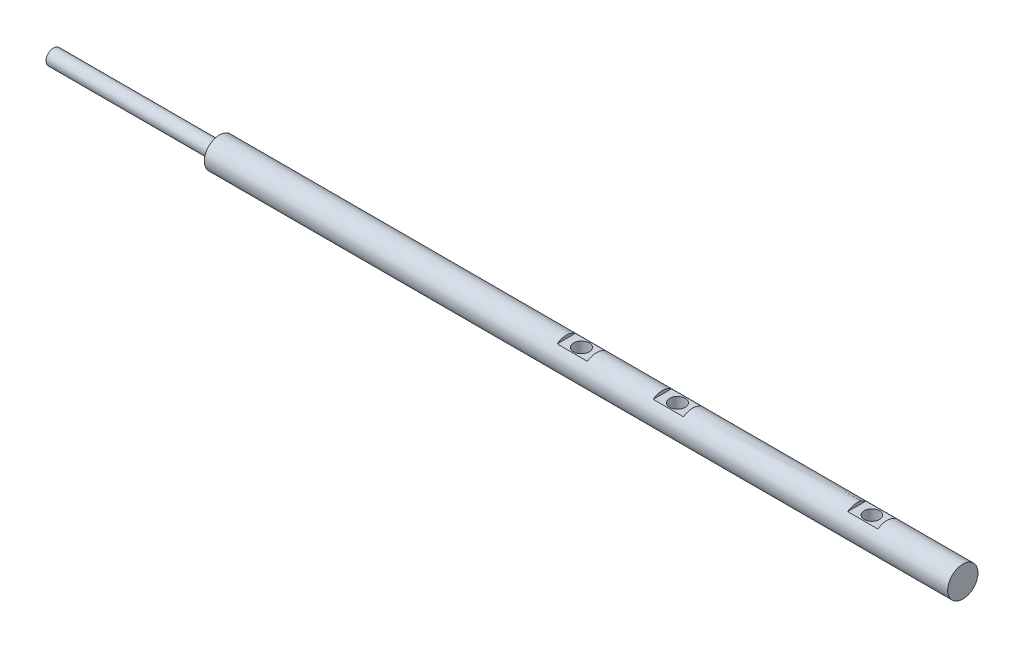
ISO-10303-21;
HEADER;
FILE_DESCRIPTION(('STEP AP214'),'2;1');
FILE_NAME('part.step','',(''),(''),'','','');
FILE_SCHEMA(('AUTOMOTIVE_DESIGN { 1 0 10303 214 1 1 1 1 }'));
ENDSEC;
DATA;
#1=APPLICATION_CONTEXT('core data for automotive mechanical design processes');
#2=APPLICATION_PROTOCOL_DEFINITION('international standard','automotive_design',2000,#1);
#3=PRODUCT_CONTEXT('',#1,'mechanical');
#4=PRODUCT('Part','Part','',(#3));
#5=PRODUCT_RELATED_PRODUCT_CATEGORY('part','',(#4));
#6=PRODUCT_DEFINITION_FORMATION('','',#4);
#7=PRODUCT_DEFINITION_CONTEXT('part definition',#1,'design');
#8=PRODUCT_DEFINITION('design','',#6,#7);
#9=PRODUCT_DEFINITION_SHAPE('','',#8);
#10=(LENGTH_UNIT() NAMED_UNIT(*) SI_UNIT(.MILLI.,.METRE.));
#11=(NAMED_UNIT(*) PLANE_ANGLE_UNIT() SI_UNIT($,.RADIAN.));
#12=(NAMED_UNIT(*) SI_UNIT($,.STERADIAN.) SOLID_ANGLE_UNIT());
#13=UNCERTAINTY_MEASURE_WITH_UNIT(LENGTH_MEASURE(1.E-05),#10,'distance_accuracy_value','');
#14=(GEOMETRIC_REPRESENTATION_CONTEXT(3) GLOBAL_UNCERTAINTY_ASSIGNED_CONTEXT((#13)) GLOBAL_UNIT_ASSIGNED_CONTEXT((#10,
#11,#12)) REPRESENTATION_CONTEXT('',''));
#15=CARTESIAN_POINT('',(0.,0.,0.));
#16=DIRECTION('',(0.,0.,1.));
#17=DIRECTION('',(1.,0.,0.));
#18=AXIS2_PLACEMENT_3D('',#15,#16,#17);
#19=CARTESIAN_POINT('',(95.25,0.,0.));
#20=DIRECTION('',(-1.,0.,0.));
#21=DIRECTION('',(0.,0.,1.));
#22=AXIS2_PLACEMENT_3D('',#19,#20,#21);
#23=CYLINDRICAL_SURFACE('',#22,3.175);
#24=CARTESIAN_POINT('',(-60.49518,0.,0.));
#25=DIRECTION('',(-1.,0.,0.));
#26=DIRECTION('',(0.,0.,1.));
#27=AXIS2_PLACEMENT_3D('',#24,#25,#26);
#28=CIRCLE('',#27,3.175);
#29=CARTESIAN_POINT('',(-60.49518,0.,3.175));
#30=VERTEX_POINT('',#29);
#31=EDGE_CURVE('E116',#30,#30,#28,.T.);
#32=ORIENTED_EDGE('',*,*,#31,.F.);
#33=EDGE_LOOP('',(#32));
#34=FACE_BOUND('',#33,.T.);
#35=CARTESIAN_POINT('',(13.70965,-3.175,0.));
#36=CARTESIAN_POINT('',(13.7096555225033,-3.1749951488375,0.0855040308867805));
#37=CARTESIAN_POINT('',(13.716409178857,-3.17150945034315,0.171101240980395));
#38=CARTESIAN_POINT('',(13.7431163776356,-3.15790866903868,0.339747436628676));
#39=CARTESIAN_POINT('',(13.7630930920065,-3.14778194886196,0.422791680581358));
#40=CARTESIAN_POINT('',(13.8152492367121,-3.12195472243027,0.583638724841478));
#41=CARTESIAN_POINT('',(13.847380383854,-3.10627628578511,0.661460848087699));
#42=CARTESIAN_POINT('',(13.922673342814,-3.07076815311594,0.810484123550459));
#43=CARTESIAN_POINT('',(13.9658346813397,-3.05093863521649,0.881685559674048));
#44=CARTESIAN_POINT('',(14.0650395604511,-3.00746719747756,1.02048121130391));
#45=CARTESIAN_POINT('',(14.1217224488686,-2.98366396287073,1.08756713179621));
#46=CARTESIAN_POINT('',(14.2449778321314,-2.93542614793103,1.2117528273621));
#47=CARTESIAN_POINT('',(14.311558245603,-2.91099107513947,1.2688445260646));
#48=CARTESIAN_POINT('',(14.4593429961395,-2.86190360269902,1.37619030697555));
#49=CARTESIAN_POINT('',(14.5413028961507,-2.8374019830861,1.4254815020746));
#50=CARTESIAN_POINT('',(14.7137279187006,-2.79368352283181,1.50937386299454));
#51=CARTESIAN_POINT('',(14.804186670407,-2.77446276535016,1.54398592681111));
#52=CARTESIAN_POINT('',(14.9854318810971,-2.74531170361422,1.59521646703194));
#53=CARTESIAN_POINT('',(15.0758597461213,-2.7348849779048,1.61280618820741));
#54=CARTESIAN_POINT('',(15.2589330951833,-2.72321398214474,1.63244506669712));
#55=CARTESIAN_POINT('',(15.3515760410271,-2.72195966421048,1.63451122931009));
#56=CARTESIAN_POINT('',(15.5236642889754,-2.72838052371713,1.62375488998901));
#57=CARTESIAN_POINT('',(15.6032793205153,-2.73493188161207,1.61280661192532));
#58=CARTESIAN_POINT('',(15.7593289781891,-2.754244052702,1.57959805780023));
#59=CARTESIAN_POINT('',(15.8357624793788,-2.76700704233323,1.55733381672187));
#60=CARTESIAN_POINT('',(15.9854619863812,-2.79757317703649,1.50174237151051));
#61=CARTESIAN_POINT('',(16.0586140956642,-2.81548590050608,1.46817158068447));
#62=CARTESIAN_POINT('',(16.1986068420419,-2.85434643346265,1.3911117741889));
#63=CARTESIAN_POINT('',(16.2654446252442,-2.87529560459822,1.34761830379583));
#64=CARTESIAN_POINT('',(16.4004112960908,-2.9212823355769,1.24510866496992));
#65=CARTESIAN_POINT('',(16.4674961673622,-2.94649001082675,1.18478955639875));
#66=CARTESIAN_POINT('',(16.5910475723355,-2.99587607308416,1.05368879547657));
#67=CARTESIAN_POINT('',(16.6475084679871,-3.02005390832908,0.982901623202313));
#68=CARTESIAN_POINT('',(16.7509700161712,-3.06617549731913,0.828265705690739));
#69=CARTESIAN_POINT('',(16.7973314172438,-3.08793935855511,0.743931167771745));
#70=CARTESIAN_POINT('',(16.8748180876571,-3.12521410360782,0.567260694455102));
#71=CARTESIAN_POINT('',(16.9059560898711,-3.14073021113217,0.474931522136976));
#72=CARTESIAN_POINT('',(16.9494353646927,-3.16262223827194,0.293387639639186));
#73=CARTESIAN_POINT('',(16.9631610922109,-3.16966860606962,0.204586275933954));
#74=CARTESIAN_POINT('',(16.9758065067292,-3.17615517440242,0.0256756682936787));
#75=CARTESIAN_POINT('',(16.9747338203541,-3.1755992928927,-0.0644328780430827));
#76=CARTESIAN_POINT('',(16.9585694600984,-3.16732011452037,-0.23544240019834));
#77=CARTESIAN_POINT('',(16.9446474939361,-3.16019489932875,-0.316487355429186));
#78=CARTESIAN_POINT('',(16.9050532383627,-3.14029584966157,-0.474914137414348));
#79=CARTESIAN_POINT('',(16.8793796852722,-3.12752140771467,-0.552295569232577));
#80=CARTESIAN_POINT('',(16.8163979936897,-3.0970332421052,-0.703659850689299));
#81=CARTESIAN_POINT('',(16.7787917765208,-3.07919436719925,-0.777492553668176));
#82=CARTESIAN_POINT('',(16.6933576756426,-3.04025788262466,-0.918032193793198));
#83=CARTESIAN_POINT('',(16.6455255652911,-3.01915892647785,-0.984736167288267));
#84=CARTESIAN_POINT('',(16.5353647755565,-2.97316030571577,-1.11637209875045));
#85=CARTESIAN_POINT('',(16.4720535975356,-2.94809264371233,-1.18042445249867));
#86=CARTESIAN_POINT('',(16.3356099268942,-2.89851338679948,-1.29741693757462));
#87=CARTESIAN_POINT('',(16.2624697567467,-2.87400224426708,-1.35034829848397));
#88=CARTESIAN_POINT('',(16.1033223874983,-2.82692373103994,-1.44642697458146));
#89=CARTESIAN_POINT('',(16.0168238429623,-2.80454223847877,-1.4888598544623));
#90=CARTESIAN_POINT('',(15.8364087006801,-2.76667242464635,-1.55811686536916));
#91=CARTESIAN_POINT('',(15.7425023439866,-2.75117477674318,-1.58496213065223));
#92=CARTESIAN_POINT('',(15.5596853526163,-2.73084264145901,-1.61972010578002));
#93=CARTESIAN_POINT('',(15.4711787017558,-2.72511675716505,-1.62922186279037));
#94=CARTESIAN_POINT('',(15.293687714574,-2.72246308853735,-1.63365628662517));
#95=CARTESIAN_POINT('',(15.2047036525793,-2.72553069992366,-1.62859657783691));
#96=CARTESIAN_POINT('',(15.0387499074751,-2.73915192416444,-1.60555713446222));
#97=CARTESIAN_POINT('',(14.9615054098004,-2.74887888063314,-1.5890014905719));
#98=CARTESIAN_POINT('',(14.8109982454205,-2.77369521283357,-1.54527280818543));
#99=CARTESIAN_POINT('',(14.7377369351526,-2.78878640228,-1.51809617829069));
#100=CARTESIAN_POINT('',(14.5918581146745,-2.82384943425745,-1.4518910164788));
#101=CARTESIAN_POINT('',(14.5196078760544,-2.84407923565314,-1.41219413521423));
#102=CARTESIAN_POINT('',(14.3823147021694,-2.88675020129082,-1.32278190926592));
#103=CARTESIAN_POINT('',(14.3172756362287,-2.9091925406384,-1.27306122601301));
#104=CARTESIAN_POINT('',(14.1873779098411,-2.95727706115646,-1.15738981002724));
#105=CARTESIAN_POINT('',(14.1236590585516,-2.98295328229731,-1.09016618990104));
#106=CARTESIAN_POINT('',(14.0081126673504,-3.03196509152523,-0.945333004302657));
#107=CARTESIAN_POINT('',(13.9562920125456,-3.05529932000234,-0.867717466275226));
#108=CARTESIAN_POINT('',(13.8656042427264,-3.09746555259877,-0.70262825629564));
#109=CARTESIAN_POINT('',(13.8269237810695,-3.11623168849883,-0.615034384222231));
#110=CARTESIAN_POINT('',(13.7653591182301,-3.14661314164253,-0.433428747203523));
#111=CARTESIAN_POINT('',(13.7424310751803,-3.15824829587962,-0.339435601668967));
#112=CARTESIAN_POINT('',(13.7218932306584,-3.16872129723131,-0.203672524735649));
#113=CARTESIAN_POINT('',(13.7173093436488,-3.17106888783632,-0.163117552345117));
#114=CARTESIAN_POINT('',(13.7111863698368,-3.17420941832953,-0.0817154873383522));
#115=CARTESIAN_POINT('',(13.7096473604074,-3.1750023187116,-0.0408683873253526));
#116=CARTESIAN_POINT('',(13.70965,-3.175,0.));
#117=B_SPLINE_CURVE_WITH_KNOTS('',3,(#35,#36,#37,#38,#39,#40,#41,#42,#43,#44,#45,#46,#47,#48,
#49,#50,#51,#52,#53,#54,#55,#56,#57,#58,#59,#60,#61,#62,#63,#64,#65,#66,#67,#68,#69,#70,#71,#72,
#73,#74,#75,#76,#77,#78,#79,#80,#81,#82,#83,#84,#85,#86,#87,#88,#89,#90,#91,#92,#93,#94,#95,#96,
#97,#98,#99,#100,#101,#102,#103,#104,#105,#106,#107,#108,#109,#110,#111,#112,#113,#114,#115,
#116),.UNSPECIFIED.,.T.,.F.,(4,2,2,2,2,2,2,2,2,2,2,2,2,2,2,2,2,2,2,2,2,2,2,2,2,2,2,2,2,2,2,2,2,
2,2,2,2,2,2,2,4),(0.,0.256346681545551,0.513143775789516,0.768931283875213,1.02470781826619,
1.29656656346874,1.56864399473168,1.86333819539519,2.15781322626888,2.43427334950283,
2.71043057998311,2.95119493604628,3.19204371210591,3.43845399875807,3.68497512818486,
3.96477950659084,4.2447319584856,4.53914409915753,4.8333095700008,5.10221547434754,
5.37098279845148,5.61746624990919,5.86397621261565,6.11720599093004,6.37054063911959,
6.64979553878126,6.92926984912039,7.22440425351111,7.51913756384896,7.78517049872057,
8.0510641640248,8.28881648429831,8.52664926820862,8.7803088971381,9.03410398105978,
9.3211468197276,9.60835534464037,9.89948790747403,10.1898068764044,10.3123298633967,
10.4348559637725),.UNSPECIFIED.);
#118=CARTESIAN_POINT('',(13.70965,-3.175,0.));
#119=VERTEX_POINT('',#118);
#120=EDGE_CURVE('E151',#119,#119,#117,.T.);
#121=ORIENTED_EDGE('',*,*,#120,.T.);
#122=EDGE_LOOP('',(#121));
#123=FACE_BOUND('',#122,.T.);
#124=DIRECTION('',(-1.,0.,0.));
#125=VECTOR('',#124,1.);
#126=CARTESIAN_POINT('',(95.25,2.54,1.905));
#127=LINE('',#126,#125);
#128=CARTESIAN_POINT('',(18.5166,2.54,1.905));
#129=VERTEX_POINT('',#128);
#130=CARTESIAN_POINT('',(12.1666,2.54,1.905));
#131=VERTEX_POINT('',#130);
#132=EDGE_CURVE('E132',#129,#131,#127,.T.);
#133=ORIENTED_EDGE('',*,*,#132,.T.);
#134=CARTESIAN_POINT('',(12.1666,0.,0.));
#135=DIRECTION('',(-1.,0.,0.));
#136=DIRECTION('',(0.,0.,1.));
#137=AXIS2_PLACEMENT_3D('',#134,#135,#136);
#138=CIRCLE('',#137,3.175);
#139=CARTESIAN_POINT('',(12.1666,2.54,-1.905));
#140=VERTEX_POINT('',#139);
#141=EDGE_CURVE('E208',#131,#140,#138,.T.);
#142=ORIENTED_EDGE('',*,*,#141,.T.);
#143=DIRECTION('',(-1.,0.,0.));
#144=VECTOR('',#143,1.);
#145=CARTESIAN_POINT('',(95.25,2.54,-1.905));
#146=LINE('',#145,#144);
#147=CARTESIAN_POINT('',(18.5166,2.54,-1.905));
#148=VERTEX_POINT('',#147);
#149=EDGE_CURVE('E129',#140,#148,#146,.F.);
#150=ORIENTED_EDGE('',*,*,#149,.T.);
#151=CARTESIAN_POINT('',(18.5166,0.,0.));
#152=DIRECTION('',(-1.,0.,0.));
#153=DIRECTION('',(0.,0.,1.));
#154=AXIS2_PLACEMENT_3D('',#151,#152,#153);
#155=CIRCLE('',#154,3.175);
#156=EDGE_CURVE('E206',#129,#148,#155,.T.);
#157=ORIENTED_EDGE('',*,*,#156,.F.);
#158=EDGE_LOOP('',(#133,#142,#150,#157));
#159=FACE_BOUND('',#158,.T.);
#160=CARTESIAN_POINT('',(33.82645,-3.175,0.));
#161=CARTESIAN_POINT('',(33.8264555225033,-3.1749951488375,0.0855040308867798));
#162=CARTESIAN_POINT('',(33.833209178857,-3.17150945034314,0.171101240980394));
#163=CARTESIAN_POINT('',(33.8599163776356,-3.15790866903868,0.339747436628674));
#164=CARTESIAN_POINT('',(33.8798930920065,-3.14778194886196,0.422791680581357));
#165=CARTESIAN_POINT('',(33.9320492367121,-3.12195472243027,0.583638724841476));
#166=CARTESIAN_POINT('',(33.964180383854,-3.10627628578511,0.661460848087696));
#167=CARTESIAN_POINT('',(34.0394733428141,-3.07076815311594,0.810484123550455));
#168=CARTESIAN_POINT('',(34.0826346813397,-3.05093863521649,0.881685559674045));
#169=CARTESIAN_POINT('',(34.1818395604511,-3.00746719747756,1.02048121130391));
#170=CARTESIAN_POINT('',(34.2385224488686,-2.98366396287073,1.08756713179621));
#171=CARTESIAN_POINT('',(34.3617778321314,-2.93542614793103,1.2117528273621));
#172=CARTESIAN_POINT('',(34.428358245603,-2.91099107513947,1.2688445260646));
#173=CARTESIAN_POINT('',(34.5761429961395,-2.86190360269902,1.37619030697555));
#174=CARTESIAN_POINT('',(34.6581028961507,-2.83740198308611,1.42548150207459));
#175=CARTESIAN_POINT('',(34.8305279187006,-2.79368352283181,1.50937386299453));
#176=CARTESIAN_POINT('',(34.920986670407,-2.77446276535017,1.5439859268111));
#177=CARTESIAN_POINT('',(35.1022318810971,-2.74531170361422,1.59521646703193));
#178=CARTESIAN_POINT('',(35.1926597461213,-2.73488497790481,1.6128061882074));
#179=CARTESIAN_POINT('',(35.3757330951833,-2.72321398214475,1.63244506669711));
#180=CARTESIAN_POINT('',(35.4683760410271,-2.72195966421048,1.63451122931009));
#181=CARTESIAN_POINT('',(35.6404642889754,-2.72838052371714,1.62375488998901));
#182=CARTESIAN_POINT('',(35.7200793205153,-2.73493188161208,1.61280661192532));
#183=CARTESIAN_POINT('',(35.8761289781891,-2.754244052702,1.57959805780023));
#184=CARTESIAN_POINT('',(35.9525624793788,-2.76700704233323,1.55733381672187));
#185=CARTESIAN_POINT('',(36.1022619863812,-2.79757317703649,1.50174237151051));
#186=CARTESIAN_POINT('',(36.1754140956642,-2.81548590050608,1.46817158068447));
#187=CARTESIAN_POINT('',(36.3154068420419,-2.85434643346265,1.3911117741889));
#188=CARTESIAN_POINT('',(36.3822446252442,-2.87529560459822,1.34761830379583));
#189=CARTESIAN_POINT('',(36.5172112960908,-2.9212823355769,1.24510866496992));
#190=CARTESIAN_POINT('',(36.5842961673622,-2.94649001082675,1.18478955639875));
#191=CARTESIAN_POINT('',(36.7078475723355,-2.99587607308416,1.05368879547657));
#192=CARTESIAN_POINT('',(36.7643084679871,-3.02005390832908,0.98290162320231));
#193=CARTESIAN_POINT('',(36.8677700161712,-3.06617549731913,0.828265705690738));
#194=CARTESIAN_POINT('',(36.9141314172438,-3.08793935855511,0.743931167771745));
#195=CARTESIAN_POINT('',(36.9916180876571,-3.12521410360782,0.567260694455102));
#196=CARTESIAN_POINT('',(37.0227560898711,-3.14073021113217,0.474931522136976));
#197=CARTESIAN_POINT('',(37.0662353646927,-3.16262223827194,0.293387639639186));
#198=CARTESIAN_POINT('',(37.0799610922109,-3.16966860606962,0.204586275933954));
#199=CARTESIAN_POINT('',(37.0926065067292,-3.17615517440242,0.0256756682936774));
#200=CARTESIAN_POINT('',(37.0915338203541,-3.1755992928927,-0.0644328780430845));
#201=CARTESIAN_POINT('',(37.0753694600984,-3.16732011452037,-0.23544240019834));
#202=CARTESIAN_POINT('',(37.0614474939361,-3.16019489932875,-0.316487355429185));
#203=CARTESIAN_POINT('',(37.0218532383627,-3.14029584966157,-0.474914137414346));
#204=CARTESIAN_POINT('',(36.9961796852722,-3.12752140771467,-0.552295569232576));
#205=CARTESIAN_POINT('',(36.9331979936897,-3.0970332421052,-0.7036598506893));
#206=CARTESIAN_POINT('',(36.8955917765208,-3.07919436719925,-0.777492553668178));
#207=CARTESIAN_POINT('',(36.8101576756426,-3.04025788262466,-0.918032193793199));
#208=CARTESIAN_POINT('',(36.7623255652911,-3.01915892647785,-0.984736167288267));
#209=CARTESIAN_POINT('',(36.6521647755565,-2.97316030571577,-1.11637209875045));
#210=CARTESIAN_POINT('',(36.5888535975356,-2.94809264371233,-1.18042445249867));
#211=CARTESIAN_POINT('',(36.4524099268942,-2.89851338679948,-1.29741693757462));
#212=CARTESIAN_POINT('',(36.3792697567467,-2.87400224426709,-1.35034829848397));
#213=CARTESIAN_POINT('',(36.2201223874983,-2.82692373103994,-1.44642697458146));
#214=CARTESIAN_POINT('',(36.1336238429623,-2.80454223847877,-1.4888598544623));
#215=CARTESIAN_POINT('',(35.9532087006801,-2.76667242464635,-1.55811686536916));
#216=CARTESIAN_POINT('',(35.8593023439866,-2.75117477674318,-1.58496213065223));
#217=CARTESIAN_POINT('',(35.6764853526163,-2.73084264145901,-1.61972010578002));
#218=CARTESIAN_POINT('',(35.5879787017558,-2.72511675716505,-1.62922186279037));
#219=CARTESIAN_POINT('',(35.410487714574,-2.72246308853736,-1.63365628662516));
#220=CARTESIAN_POINT('',(35.3215036525793,-2.72553069992366,-1.62859657783691));
#221=CARTESIAN_POINT('',(35.1555499074751,-2.73915192416445,-1.60555713446221));
#222=CARTESIAN_POINT('',(35.0783054098004,-2.74887888063314,-1.5890014905719));
#223=CARTESIAN_POINT('',(34.9277982454205,-2.77369521283357,-1.54527280818542));
#224=CARTESIAN_POINT('',(34.8545369351526,-2.78878640228,-1.51809617829068));
#225=CARTESIAN_POINT('',(34.7086581146745,-2.82384943425746,-1.4518910164788));
#226=CARTESIAN_POINT('',(34.6364078760544,-2.84407923565314,-1.41219413521422));
#227=CARTESIAN_POINT('',(34.4991147021694,-2.88675020129082,-1.32278190926592));
#228=CARTESIAN_POINT('',(34.4340756362287,-2.9091925406384,-1.27306122601301));
#229=CARTESIAN_POINT('',(34.3041779098411,-2.95727706115646,-1.15738981002724));
#230=CARTESIAN_POINT('',(34.2404590585516,-2.98295328229731,-1.09016618990103));
#231=CARTESIAN_POINT('',(34.1249126673504,-3.03196509152523,-0.945333004302651));
#232=CARTESIAN_POINT('',(34.0730920125456,-3.05529932000234,-0.867717466275219));
#233=CARTESIAN_POINT('',(33.9824042427265,-3.09746555259877,-0.702628256295633));
#234=CARTESIAN_POINT('',(33.9437237810696,-3.11623168849883,-0.615034384222225));
#235=CARTESIAN_POINT('',(33.8821591182301,-3.14661314164253,-0.433428747203517));
#236=CARTESIAN_POINT('',(33.8592310751803,-3.15824829587962,-0.33943560166896));
#237=CARTESIAN_POINT('',(33.8386932306584,-3.16872129723131,-0.203672524735642));
#238=CARTESIAN_POINT('',(33.8341093436488,-3.17106888783632,-0.163117552345112));
#239=CARTESIAN_POINT('',(33.8279863698368,-3.17420941832953,-0.0817154873383494));
#240=CARTESIAN_POINT('',(33.8264473604074,-3.1750023187116,-0.0408683873253513));
#241=CARTESIAN_POINT('',(33.82645,-3.175,0.));
#242=B_SPLINE_CURVE_WITH_KNOTS('',3,(#160,#161,#162,#163,#164,#165,#166,#167,#168,#169,#170,
#171,#172,#173,#174,#175,#176,#177,#178,#179,#180,#181,#182,#183,#184,#185,#186,#187,#188,#189,
#190,#191,#192,#193,#194,#195,#196,#197,#198,#199,#200,#201,#202,#203,#204,#205,#206,#207,#208,
#209,#210,#211,#212,#213,#214,#215,#216,#217,#218,#219,#220,#221,#222,#223,#224,#225,#226,#227,
#228,#229,#230,#231,#232,#233,#234,#235,#236,#237,#238,#239,#240,#241),.UNSPECIFIED.,.T.,.F.,(4,
2,2,2,2,2,2,2,2,2,2,2,2,2,2,2,2,2,2,2,2,2,2,2,2,2,2,2,2,2,2,2,2,2,2,2,2,2,2,2,4),(0.,
0.256346681545549,0.513143775789515,0.768931283875209,1.02470781826618,1.29656656346873,
1.56864399473168,1.86333819539519,2.15781322626888,2.43427334950282,2.7104305799831,
2.95119493604626,3.19204371210589,3.43845399875805,3.68497512818485,3.96477950659083,
4.24473195848559,4.53914409915751,4.83330957000078,5.10221547434752,5.37098279845146,
5.61746624990917,5.86397621261563,6.11720599093002,6.37054063911958,6.64979553878125,
6.92926984912037,7.22440425351108,7.51913756384894,7.78517049872054,8.05106416402478,
8.28881648429829,8.5266492682086,8.78030889713808,9.03410398105976,9.32114681972758,
9.60835534464034,9.89948790747401,10.1898068764044,10.3123298633967,10.4348559637725),.UNSPECIFIED.);
#243=CARTESIAN_POINT('',(33.82645,-3.175,0.));
#244=VERTEX_POINT('',#243);
#245=EDGE_CURVE('E144',#244,#244,#242,.T.);
#246=ORIENTED_EDGE('',*,*,#245,.T.);
#247=EDGE_LOOP('',(#246));
#248=FACE_BOUND('',#247,.T.);
#249=DIRECTION('',(-1.,0.,0.));
#250=VECTOR('',#249,1.);
#251=CARTESIAN_POINT('',(95.25,2.54000000000001,1.90499999999998));
#252=LINE('',#251,#250);
#253=CARTESIAN_POINT('',(32.2833263903507,2.54,1.905));
#254=VERTEX_POINT('',#253);
#255=CARTESIAN_POINT('',(38.6333263903507,2.54,1.90499999999998));
#256=VERTEX_POINT('',#255);
#257=EDGE_CURVE('E136',#254,#256,#252,.F.);
#258=ORIENTED_EDGE('',*,*,#257,.F.);
#259=CARTESIAN_POINT('',(32.2833263903507,0.,0.));
#260=DIRECTION('',(-1.,0.,0.));
#261=DIRECTION('',(0.,-1.,0.));
#262=AXIS2_PLACEMENT_3D('',#259,#260,#261);
#263=CIRCLE('',#262,3.175);
#264=CARTESIAN_POINT('',(32.2833263903507,2.54,-1.905));
#265=VERTEX_POINT('',#264);
#266=EDGE_CURVE('E247',#254,#265,#263,.T.);
#267=ORIENTED_EDGE('',*,*,#266,.T.);
#268=DIRECTION('',(-1.,0.,0.));
#269=VECTOR('',#268,1.);
#270=CARTESIAN_POINT('',(95.25,2.54000000000001,-1.90499999999998));
#271=LINE('',#270,#269);
#272=CARTESIAN_POINT('',(38.6333263903507,2.54,-1.90499999999998));
#273=VERTEX_POINT('',#272);
#274=EDGE_CURVE('E139',#273,#265,#271,.T.);
#275=ORIENTED_EDGE('',*,*,#274,.F.);
#276=CARTESIAN_POINT('',(38.6333263903507,0.,0.));
#277=DIRECTION('',(-1.,0.,0.));
#278=DIRECTION('',(0.,-1.,0.));
#279=AXIS2_PLACEMENT_3D('',#276,#277,#278);
#280=CIRCLE('',#279,3.175);
#281=EDGE_CURVE('E244',#256,#273,#280,.T.);
#282=ORIENTED_EDGE('',*,*,#281,.F.);
#283=EDGE_LOOP('',(#258,#267,#275,#282));
#284=FACE_BOUND('',#283,.T.);
#285=CARTESIAN_POINT('',(95.25,0.,0.));
#286=DIRECTION('',(1.,0.,0.));
#287=DIRECTION('',(0.,0.,-1.));
#288=AXIS2_PLACEMENT_3D('',#285,#286,#287);
#289=CIRCLE('',#288,3.175);
#290=CARTESIAN_POINT('',(95.25,0.,-3.175));
#291=VERTEX_POINT('',#290);
#292=EDGE_CURVE('E141',#291,#291,#289,.T.);
#293=ORIENTED_EDGE('',*,*,#292,.F.);
#294=EDGE_LOOP('',(#293));
#295=FACE_BOUND('',#294,.T.);
#296=CARTESIAN_POINT('',(74.6,-3.175,0.));
#297=CARTESIAN_POINT('',(74.6000053302938,-3.17499535783324,0.0840354915149768));
#298=CARTESIAN_POINT('',(74.6066594589189,-3.17162798348649,0.168168779521892));
#299=CARTESIAN_POINT('',(74.6329793102087,-3.15848916648331,0.333943731430197));
#300=CARTESIAN_POINT('',(74.6526692251752,-3.14870581713883,0.415580466872125));
#301=CARTESIAN_POINT('',(74.7040923524778,-3.12375781958318,0.573712215402848));
#302=CARTESIAN_POINT('',(74.7357785177025,-3.10861420825035,0.650225957772119));
#303=CARTESIAN_POINT('',(74.8100483853979,-3.07433040312312,0.796734971886589));
#304=CARTESIAN_POINT('',(74.8526313399745,-3.05519048362937,0.866730690542695));
#305=CARTESIAN_POINT('',(74.9504457137184,-3.01329382894349,1.00303295198782));
#306=CARTESIAN_POINT('',(75.0062915058047,-2.99038746996231,1.06885191693151));
#307=CARTESIAN_POINT('',(75.1277216117106,-2.94402038200131,1.1906399418154));
#308=CARTESIAN_POINT('',(75.1933134010081,-2.92055923920394,1.2466013680702));
#309=CARTESIAN_POINT('',(75.3385923499936,-2.8735972507713,1.3515267720256));
#310=CARTESIAN_POINT('',(75.4189840376524,-2.85024003635121,1.3995871987482));
#311=CARTESIAN_POINT('',(75.5880070650077,-2.80864446063059,1.48130263507995));
#312=CARTESIAN_POINT('',(75.6766323954944,-2.79040240457287,1.51496805169956));
#313=CARTESIAN_POINT('',(75.8541695778291,-2.76279246709811,1.56472810353283));
#314=CARTESIAN_POINT('',(75.9427423398433,-2.75295606862979,1.5817593080726));
#315=CARTESIAN_POINT('',(76.1219886479655,-2.7420330345164,1.60062890319786));
#316=CARTESIAN_POINT('',(76.2126599638322,-2.74093750236889,1.6024827414415));
#317=CARTESIAN_POINT('',(76.3816351115733,-2.74724429166475,1.59163154217512));
#318=CARTESIAN_POINT('',(76.4600986695383,-2.75362655636238,1.58067445141354));
#319=CARTESIAN_POINT('',(76.6138739769145,-2.7723791566237,1.54754562929881));
#320=CARTESIAN_POINT('',(76.689184686588,-2.78475145092348,1.52537022945871));
#321=CARTESIAN_POINT('',(76.8366681718284,-2.81435930685815,1.47003606631846));
#322=CARTESIAN_POINT('',(76.9087272406293,-2.83170127706523,1.43663386757883));
#323=CARTESIAN_POINT('',(77.0465662398621,-2.8693019507361,1.35998233689641));
#324=CARTESIAN_POINT('',(77.1123433288601,-2.88956196378043,1.31672857860477));
#325=CARTESIAN_POINT('',(77.2446893731418,-2.93387506692029,1.21509386917566));
#326=CARTESIAN_POINT('',(77.3102647110306,-2.95808021315624,1.15548100893332));
#327=CARTESIAN_POINT('',(77.4309052350403,-3.00544028389515,1.02601464463281));
#328=CARTESIAN_POINT('',(77.4859652452481,-3.02859468694246,0.956156127156334));
#329=CARTESIAN_POINT('',(77.5864937271956,-3.07259636724775,0.803951968011428));
#330=CARTESIAN_POINT('',(77.6313770051695,-3.09328018134045,0.72116869994249));
#331=CARTESIAN_POINT('',(77.7062090135627,-3.12860953391151,0.547920899458239));
#332=CARTESIAN_POINT('',(77.736169777858,-3.14325993622266,0.457462625481168));
#333=CARTESIAN_POINT('',(77.7778112873131,-3.16382934030032,0.279548388931927));
#334=CARTESIAN_POINT('',(77.7908120469717,-3.17037646386805,0.192474739042158));
#335=CARTESIAN_POINT('',(77.8023146339987,-3.17616259333521,0.0171487539619197));
#336=CARTESIAN_POINT('',(77.8008234935826,-3.17540514379075,-0.0711029887972685));
#337=CARTESIAN_POINT('',(77.7841361389553,-3.1670286531299,-0.238862443066177));
#338=CARTESIAN_POINT('',(77.7700320157855,-3.15995644705834,-0.318510122582015));
#339=CARTESIAN_POINT('',(77.7302420474498,-3.14037681933826,-0.474144110594149));
#340=CARTESIAN_POINT('',(77.7045549344028,-3.12786880268801,-0.55013001726243));
#341=CARTESIAN_POINT('',(77.6416703773161,-3.09810446022253,-0.698774171394191));
#342=CARTESIAN_POINT('',(77.6041682987794,-3.08072398988326,-0.771277795552411));
#343=CARTESIAN_POINT('',(77.5190642219682,-3.04287751276249,-0.9091997091513));
#344=CARTESIAN_POINT('',(77.4714579526931,-3.02241020224828,-0.974614984657519));
#345=CARTESIAN_POINT('',(77.362041549466,-2.97795622125717,-1.10339947941933));
#346=CARTESIAN_POINT('',(77.2992900325941,-2.95382193757618,-1.16591935656052));
#347=CARTESIAN_POINT('',(77.1641573926767,-2.90623909415635,-1.27993115643406));
#348=CARTESIAN_POINT('',(77.0917694072597,-2.88279103774906,-1.33141515139894));
#349=CARTESIAN_POINT('',(76.9348134298206,-2.83807069855987,-1.42435114695634));
#350=CARTESIAN_POINT('',(76.8498148770725,-2.81696816343404,-1.46516499114653));
#351=CARTESIAN_POINT('',(76.6727545325095,-2.78148358503796,-1.53147278933151));
#352=CARTESIAN_POINT('',(76.580702157435,-2.76709275764308,-1.55698677998933));
#353=CARTESIAN_POINT('',(76.401636774489,-2.74847942890825,-1.58959332041481));
#354=CARTESIAN_POINT('',(76.3149941581642,-2.74340999965211,-1.59822539037285));
#355=CARTESIAN_POINT('',(76.1413893014996,-2.7416313931857,-1.60127783888239));
#356=CARTESIAN_POINT('',(76.054427225333,-2.7449183961953,-1.59570471072032));
#357=CARTESIAN_POINT('',(75.8916626844367,-2.75857784227936,-1.57194973275587));
#358=CARTESIAN_POINT('',(75.8156027495704,-2.76822304925078,-1.55505935669735));
#359=CARTESIAN_POINT('',(75.6674859179657,-2.7926425656752,-1.51076412331701));
#360=CARTESIAN_POINT('',(75.5954303343405,-2.80741854624029,-1.48335583996735));
#361=CARTESIAN_POINT('',(75.4520120896794,-2.84164246777158,-1.41675015002022));
#362=CARTESIAN_POINT('',(75.3810200909455,-2.86133730315688,-1.37688529746115));
#363=CARTESIAN_POINT('',(75.2462670114453,-2.90277676664345,-1.28722599702432));
#364=CARTESIAN_POINT('',(75.1825097507218,-2.92452246663621,-1.23742634135305));
#365=CARTESIAN_POINT('',(75.0558015643334,-2.97084433449376,-1.12206548730574));
#366=CARTESIAN_POINT('',(74.9939333252761,-2.99543675289237,-1.05531509204287));
#367=CARTESIAN_POINT('',(74.8820222933981,-3.04222008165361,-0.911713112697501));
#368=CARTESIAN_POINT('',(74.8319859979912,-3.06440966891292,-0.834856014481984));
#369=CARTESIAN_POINT('',(74.7450091850392,-3.10420898161586,-0.672009756045158));
#370=CARTESIAN_POINT('',(74.7081883075099,-3.12177650014219,-0.585945894888754));
#371=CARTESIAN_POINT('',(74.6500254256337,-3.14998272237547,-0.407802840894724));
#372=CARTESIAN_POINT('',(74.6286397085253,-3.16064098447081,-0.315741446945433));
#373=CARTESIAN_POINT('',(74.6103636993865,-3.16978794568765,-0.185594045749865));
#374=CARTESIAN_POINT('',(74.6064830013396,-3.17173718875629,-0.14861594668812));
#375=CARTESIAN_POINT('',(74.601299935654,-3.17434426182224,-0.0744316326023231));
#376=CARTESIAN_POINT('',(74.5999976388264,-3.17500205635219,-0.0372254113414476));
#377=CARTESIAN_POINT('',(74.6,-3.175,0.));
#378=B_SPLINE_CURVE_WITH_KNOTS('',3,(#296,#297,#298,#299,#300,#301,#302,#303,#304,#305,#306,
#307,#308,#309,#310,#311,#312,#313,#314,#315,#316,#317,#318,#319,#320,#321,#322,#323,#324,#325,
#326,#327,#328,#329,#330,#331,#332,#333,#334,#335,#336,#337,#338,#339,#340,#341,#342,#343,#344,
#345,#346,#347,#348,#349,#350,#351,#352,#353,#354,#355,#356,#357,#358,#359,#360,#361,#362,#363,
#364,#365,#366,#367,#368,#369,#370,#371,#372,#373,#374,#375,#376,#377),.UNSPECIFIED.,.T.,.F.,(4,
2,2,2,2,2,2,2,2,2,2,2,2,2,2,2,2,2,2,2,2,2,2,2,2,2,2,2,2,2,2,2,2,2,2,2,2,2,2,2,4),(0.,
0.251955534825392,0.504379973850656,0.755824536273966,1.00725184558626,1.27405902813782,
1.54107192661853,1.8292040761625,2.11712756415386,2.38770073641318,2.65799848261545,
2.89533223516459,3.13274364817973,3.37567629424472,3.6187183070884,3.89313033479063,
4.16767708892703,4.45536408295937,4.74281870208549,5.00621612770792,5.26948574573092,
5.51195547750949,5.75445175661891,6.00379777377197,6.2532493991339,6.52749050979908,
6.80192796972192,7.09022891066148,7.37815146390542,7.63830135458649,7.89833235042563,
8.13283676074482,8.36741762177863,8.61773304932981,8.86818003788744,9.14971814233355,
9.43141049392026,9.71559226486803,9.99896603380212,10.1105723406552,10.2221817125354),.UNSPECIFIED.);
#379=CARTESIAN_POINT('',(74.6,-3.175,0.));
#380=VERTEX_POINT('',#379);
#381=EDGE_CURVE('E204',#380,#380,#378,.T.);
#382=ORIENTED_EDGE('',*,*,#381,.T.);
#383=EDGE_LOOP('',(#382));
#384=FACE_BOUND('',#383,.T.);
#385=CARTESIAN_POINT('',(79.375,0.,0.));
#386=DIRECTION('',(-1.,0.,0.));
#387=DIRECTION('',(0.,0.,1.));
#388=AXIS2_PLACEMENT_3D('',#385,#386,#387);
#389=CIRCLE('',#388,3.175);
#390=CARTESIAN_POINT('',(79.375,2.54,1.905));
#391=VERTEX_POINT('',#390);
#392=CARTESIAN_POINT('',(79.375,2.54,-1.905));
#393=VERTEX_POINT('',#392);
#394=EDGE_CURVE('E11',#391,#393,#389,.T.);
#395=ORIENTED_EDGE('',*,*,#394,.F.);
#396=DIRECTION('',(-1.,0.,0.));
#397=VECTOR('',#396,1.);
#398=CARTESIAN_POINT('',(95.25,2.54,1.905));
#399=LINE('',#398,#397);
#400=CARTESIAN_POINT('',(73.025,2.54,1.905));
#401=VERTEX_POINT('',#400);
#402=EDGE_CURVE('E92',#391,#401,#399,.T.);
#403=ORIENTED_EDGE('',*,*,#402,.T.);
#404=CARTESIAN_POINT('',(73.025,0.,0.));
#405=DIRECTION('',(1.,0.,0.));
#406=DIRECTION('',(0.,0.,-1.));
#407=AXIS2_PLACEMENT_3D('',#404,#405,#406);
#408=CIRCLE('',#407,3.175);
#409=CARTESIAN_POINT('',(73.025,2.54,-1.905));
#410=VERTEX_POINT('',#409);
#411=EDGE_CURVE('E47',#410,#401,#408,.T.);
#412=ORIENTED_EDGE('',*,*,#411,.F.);
#413=DIRECTION('',(-1.,0.,0.));
#414=VECTOR('',#413,1.);
#415=CARTESIAN_POINT('',(95.25,2.54,-1.905));
#416=LINE('',#415,#414);
#417=EDGE_CURVE('E94',#410,#393,#416,.F.);
#418=ORIENTED_EDGE('',*,*,#417,.T.);
#419=EDGE_LOOP('',(#395,#403,#412,#418));
#420=FACE_BOUND('',#419,.T.);
#421=ADVANCED_FACE('F39',(#34,#123,#159,#248,#284,#295,#384,#420),#23,.T.);
#422=CARTESIAN_POINT('',(35.4584,-3.175,0.));
#423=DIRECTION('',(0.,1.,0.));
#424=DIRECTION('',(0.,0.,1.));
#425=AXIS2_PLACEMENT_3D('',#422,#423,#424);
#426=CYLINDRICAL_SURFACE('',#425,1.63195);
#427=ORIENTED_EDGE('',*,*,#245,.F.);
#428=EDGE_LOOP('',(#427));
#429=FACE_BOUND('',#428,.T.);
#430=CARTESIAN_POINT('',(35.4584,2.54,0.));
#431=DIRECTION('',(0.,1.,0.));
#432=DIRECTION('',(-1.,0.,0.));
#433=AXIS2_PLACEMENT_3D('',#430,#431,#432);
#434=CIRCLE('',#433,1.63195);
#435=CARTESIAN_POINT('',(33.82645,2.54,0.));
#436=VERTEX_POINT('',#435);
#437=EDGE_CURVE('E135',#436,#436,#434,.F.);
#438=ORIENTED_EDGE('',*,*,#437,.F.);
#439=EDGE_LOOP('',(#438));
#440=FACE_BOUND('',#439,.T.);
#441=ADVANCED_FACE('F157',(#429,#440),#426,.F.);
#442=CARTESIAN_POINT('',(95.25,0.,0.));
#443=DIRECTION('',(1.,0.,0.));
#444=DIRECTION('',(0.,0.,-1.));
#445=AXIS2_PLACEMENT_3D('',#442,#443,#444);
#446=PLANE('',#445);
#447=ORIENTED_EDGE('',*,*,#292,.T.);
#448=EDGE_LOOP('',(#447));
#449=FACE_BOUND('',#448,.T.);
#450=ADVANCED_FACE('F161',(#449),#446,.T.);
#451=CARTESIAN_POINT('',(15.3416,-3.175,0.));
#452=DIRECTION('',(0.,1.,0.));
#453=DIRECTION('',(0.,0.,1.));
#454=AXIS2_PLACEMENT_3D('',#451,#452,#453);
#455=CYLINDRICAL_SURFACE('',#454,1.63195);
#456=CARTESIAN_POINT('',(15.3416,2.54,0.));
#457=DIRECTION('',(0.,-1.,0.));
#458=DIRECTION('',(0.,0.,-1.));
#459=AXIS2_PLACEMENT_3D('',#456,#457,#458);
#460=CIRCLE('',#459,1.63195);
#461=CARTESIAN_POINT('',(15.3416,2.54,-1.63195));
#462=VERTEX_POINT('',#461);
#463=EDGE_CURVE('E123',#462,#462,#460,.F.);
#464=ORIENTED_EDGE('',*,*,#463,.T.);
#465=EDGE_LOOP('',(#464));
#466=FACE_BOUND('',#465,.T.);
#467=ORIENTED_EDGE('',*,*,#120,.F.);
#468=EDGE_LOOP('',(#467));
#469=FACE_BOUND('',#468,.T.);
#470=ADVANCED_FACE('F163',(#466,#469),#455,.F.);
#471=CARTESIAN_POINT('',(18.5166,0.,-3.175));
#472=DIRECTION('',(-1.,0.,0.));
#473=DIRECTION('',(0.,0.,1.));
#474=AXIS2_PLACEMENT_3D('',#471,#472,#473);
#475=PLANE('',#474);
#476=DIRECTION('',(0.,0.,1.));
#477=VECTOR('',#476,1.);
#478=CARTESIAN_POINT('',(18.5166,2.54,-3.175));
#479=LINE('',#478,#477);
#480=EDGE_CURVE('E120',#148,#129,#479,.T.);
#481=ORIENTED_EDGE('',*,*,#480,.T.);
#482=ORIENTED_EDGE('',*,*,#156,.T.);
#483=EDGE_LOOP('',(#481,#482));
#484=FACE_BOUND('',#483,.T.);
#485=ADVANCED_FACE('F230',(#484),#475,.T.);
#486=CARTESIAN_POINT('',(12.1666,0.,-3.175));
#487=DIRECTION('',(-1.,0.,0.));
#488=DIRECTION('',(0.,0.,1.));
#489=AXIS2_PLACEMENT_3D('',#486,#487,#488);
#490=PLANE('',#489);
#491=DIRECTION('',(0.,0.,1.));
#492=VECTOR('',#491,1.);
#493=CARTESIAN_POINT('',(12.1666,2.54,-3.175));
#494=LINE('',#493,#492);
#495=EDGE_CURVE('E53',#140,#131,#494,.T.);
#496=ORIENTED_EDGE('',*,*,#495,.F.);
#497=ORIENTED_EDGE('',*,*,#141,.F.);
#498=EDGE_LOOP('',(#496,#497));
#499=FACE_BOUND('',#498,.T.);
#500=ADVANCED_FACE('F226',(#499),#490,.F.);
#501=CARTESIAN_POINT('',(0.,2.54,-3.175));
#502=DIRECTION('',(0.,-1.,0.));
#503=DIRECTION('',(0.,0.,-1.));
#504=AXIS2_PLACEMENT_3D('',#501,#502,#503);
#505=PLANE('',#504);
#506=ORIENTED_EDGE('',*,*,#463,.F.);
#507=EDGE_LOOP('',(#506));
#508=FACE_BOUND('',#507,.T.);
#509=ORIENTED_EDGE('',*,*,#480,.F.);
#510=ORIENTED_EDGE('',*,*,#149,.F.);
#511=ORIENTED_EDGE('',*,*,#495,.T.);
#512=ORIENTED_EDGE('',*,*,#132,.F.);
#513=EDGE_LOOP('',(#509,#510,#511,#512));
#514=FACE_BOUND('',#513,.T.);
#515=ADVANCED_FACE('F222',(#508,#514),#505,.F.);
#516=CARTESIAN_POINT('',(38.6333263903507,-4.22161500752225E-13,-3.175));
#517=DIRECTION('',(-1.,0.,0.));
#518=DIRECTION('',(0.,-1.,0.));
#519=AXIS2_PLACEMENT_3D('',#516,#517,#518);
#520=PLANE('',#519);
#521=DIRECTION('',(0.,0.,1.));
#522=VECTOR('',#521,1.);
#523=CARTESIAN_POINT('',(38.6333263903507,2.54,-3.175));
#524=LINE('',#523,#522);
#525=EDGE_CURVE('E125',#273,#256,#524,.T.);
#526=ORIENTED_EDGE('',*,*,#525,.T.);
#527=ORIENTED_EDGE('',*,*,#281,.T.);
#528=EDGE_LOOP('',(#526,#527));
#529=FACE_BOUND('',#528,.T.);
#530=ADVANCED_FACE('F225',(#529),#520,.T.);
#531=CARTESIAN_POINT('',(32.2833263903507,-3.52772561713152E-13,-3.175));
#532=DIRECTION('',(-1.,0.,0.));
#533=DIRECTION('',(0.,-1.,0.));
#534=AXIS2_PLACEMENT_3D('',#531,#532,#533);
#535=PLANE('',#534);
#536=DIRECTION('',(0.,0.,1.));
#537=VECTOR('',#536,1.);
#538=CARTESIAN_POINT('',(32.2833263903507,2.54,-3.175));
#539=LINE('',#538,#537);
#540=EDGE_CURVE('E60',#265,#254,#539,.T.);
#541=ORIENTED_EDGE('',*,*,#540,.F.);
#542=ORIENTED_EDGE('',*,*,#266,.F.);
#543=EDGE_LOOP('',(#541,#542));
#544=FACE_BOUND('',#543,.T.);
#545=ADVANCED_FACE('F236',(#544),#535,.F.);
#546=CARTESIAN_POINT('',(0.,2.54,-3.175));
#547=DIRECTION('',(0.,1.,0.));
#548=DIRECTION('',(-1.,0.,0.));
#549=AXIS2_PLACEMENT_3D('',#546,#547,#548);
#550=PLANE('',#549);
#551=ORIENTED_EDGE('',*,*,#437,.T.);
#552=EDGE_LOOP('',(#551));
#553=FACE_BOUND('',#552,.T.);
#554=ORIENTED_EDGE('',*,*,#274,.T.);
#555=ORIENTED_EDGE('',*,*,#540,.T.);
#556=ORIENTED_EDGE('',*,*,#257,.T.);
#557=ORIENTED_EDGE('',*,*,#525,.F.);
#558=EDGE_LOOP('',(#554,#555,#556,#557));
#559=FACE_BOUND('',#558,.T.);
#560=ADVANCED_FACE('F220',(#553,#559),#550,.T.);
#561=CARTESIAN_POINT('',(-95.250012,0.,0.));
#562=DIRECTION('',(1.,0.,0.));
#563=DIRECTION('',(0.,0.,-1.));
#564=AXIS2_PLACEMENT_3D('',#561,#562,#563);
#565=CYLINDRICAL_SURFACE('',#564,1.5875);
#566=CARTESIAN_POINT('',(-60.49518,0.,0.));
#567=DIRECTION('',(-1.,0.,0.));
#568=DIRECTION('',(0.,0.,1.));
#569=AXIS2_PLACEMENT_3D('',#566,#567,#568);
#570=CIRCLE('',#569,1.5875);
#571=CARTESIAN_POINT('',(-60.49518,0.,-1.5875));
#572=VERTEX_POINT('',#571);
#573=EDGE_CURVE('E104',#572,#572,#570,.T.);
#574=CARTESIAN_POINT('',(-95.25,0.,0.));
#575=DIRECTION('',(1.,0.,0.));
#576=DIRECTION('',(0.,0.,-1.));
#577=AXIS2_PLACEMENT_3D('',#574,#575,#576);
#578=CIRCLE('',#577,1.5875);
#579=CARTESIAN_POINT('',(-95.25,0.,-1.5875));
#580=VERTEX_POINT('',#579);
#581=EDGE_CURVE('E119',#580,#580,#578,.F.);
#582=CARTESIAN_POINT('',(-60.49518,0.,-1.5875));
#583=CARTESIAN_POINT('',(-60.857209375,0.,-1.5875));
#584=CARTESIAN_POINT('',(-61.21923875,0.,-1.5875));
#585=CARTESIAN_POINT('',(-61.9432975,0.,-1.5875));
#586=CARTESIAN_POINT('',(-62.305326875,0.,-1.5875));
#587=CARTESIAN_POINT('',(-63.029385625,0.,-1.5875));
#588=CARTESIAN_POINT('',(-63.391415,0.,-1.5875));
#589=CARTESIAN_POINT('',(-64.11547375,0.,-1.5875));
#590=CARTESIAN_POINT('',(-64.477503125,0.,-1.5875));
#591=CARTESIAN_POINT('',(-65.201561875,0.,-1.5875));
#592=CARTESIAN_POINT('',(-65.56359125,0.,-1.5875));
#593=CARTESIAN_POINT('',(-66.28765,0.,-1.5875));
#594=CARTESIAN_POINT('',(-66.649679375,0.,-1.5875));
#595=CARTESIAN_POINT('',(-67.373738125,0.,-1.5875));
#596=CARTESIAN_POINT('',(-67.7357675,0.,-1.5875));
#597=CARTESIAN_POINT('',(-68.45982625,0.,-1.5875));
#598=CARTESIAN_POINT('',(-68.821855625,0.,-1.5875));
#599=CARTESIAN_POINT('',(-69.545914375,0.,-1.5875));
#600=CARTESIAN_POINT('',(-69.90794375,0.,-1.5875));
#601=CARTESIAN_POINT('',(-70.6320025,0.,-1.5875));
#602=CARTESIAN_POINT('',(-70.994031875,0.,-1.5875));
#603=CARTESIAN_POINT('',(-71.718090625,0.,-1.5875));
#604=CARTESIAN_POINT('',(-72.08012,0.,-1.5875));
#605=CARTESIAN_POINT('',(-72.80417875,0.,-1.5875));
#606=CARTESIAN_POINT('',(-73.166208125,0.,-1.5875));
#607=CARTESIAN_POINT('',(-73.890266875,0.,-1.5875));
#608=CARTESIAN_POINT('',(-74.25229625,0.,-1.5875));
#609=CARTESIAN_POINT('',(-74.976355,0.,-1.5875));
#610=CARTESIAN_POINT('',(-75.338384375,0.,-1.5875));
#611=CARTESIAN_POINT('',(-76.062443125,0.,-1.5875));
#612=CARTESIAN_POINT('',(-76.4244725,0.,-1.5875));
#613=CARTESIAN_POINT('',(-77.14853125,0.,-1.5875));
#614=CARTESIAN_POINT('',(-77.510560625,0.,-1.5875));
#615=CARTESIAN_POINT('',(-78.234619375,0.,-1.5875));
#616=CARTESIAN_POINT('',(-78.59664875,0.,-1.5875));
#617=CARTESIAN_POINT('',(-79.3207075,0.,-1.5875));
#618=CARTESIAN_POINT('',(-79.682736875,0.,-1.5875));
#619=CARTESIAN_POINT('',(-80.406795625,0.,-1.5875));
#620=CARTESIAN_POINT('',(-80.768825,0.,-1.5875));
#621=CARTESIAN_POINT('',(-81.49288375,0.,-1.5875));
#622=CARTESIAN_POINT('',(-81.854913125,0.,-1.5875));
#623=CARTESIAN_POINT('',(-82.578971875,0.,-1.5875));
#624=CARTESIAN_POINT('',(-82.94100125,0.,-1.5875));
#625=CARTESIAN_POINT('',(-83.66506,0.,-1.5875));
#626=CARTESIAN_POINT('',(-84.027089375,0.,-1.5875));
#627=CARTESIAN_POINT('',(-84.751148125,0.,-1.5875));
#628=CARTESIAN_POINT('',(-85.1131775,0.,-1.5875));
#629=CARTESIAN_POINT('',(-85.83723625,0.,-1.5875));
#630=CARTESIAN_POINT('',(-86.199265625,0.,-1.5875));
#631=CARTESIAN_POINT('',(-86.923324375,0.,-1.5875));
#632=CARTESIAN_POINT('',(-87.28535375,0.,-1.5875));
#633=CARTESIAN_POINT('',(-88.0094125,0.,-1.5875));
#634=CARTESIAN_POINT('',(-88.371441875,0.,-1.5875));
#635=CARTESIAN_POINT('',(-89.095500625,0.,-1.5875));
#636=CARTESIAN_POINT('',(-89.45753,0.,-1.5875));
#637=CARTESIAN_POINT('',(-90.18158875,0.,-1.5875));
#638=CARTESIAN_POINT('',(-90.543618125,0.,-1.5875));
#639=CARTESIAN_POINT('',(-91.267676875,0.,-1.5875));
#640=CARTESIAN_POINT('',(-91.62970625,0.,-1.5875));
#641=CARTESIAN_POINT('',(-92.353765,0.,-1.5875));
#642=CARTESIAN_POINT('',(-92.715794375,0.,-1.5875));
#643=CARTESIAN_POINT('',(-93.439853125,0.,-1.5875));
#644=CARTESIAN_POINT('',(-93.8018825,0.,-1.5875));
#645=CARTESIAN_POINT('',(-94.52594125,0.,-1.5875));
#646=CARTESIAN_POINT('',(-94.887970625,0.,-1.5875));
#647=CARTESIAN_POINT('',(-95.25,0.,-1.5875));
#648=B_SPLINE_CURVE_WITH_KNOTS('',3,(#582,#583,#584,#585,#586,#587,#588,#589,#590,#591,#592,
#593,#594,#595,#596,#597,#598,#599,#600,#601,#602,#603,#604,#605,#606,#607,#608,#609,#610,#611,
#612,#613,#614,#615,#616,#617,#618,#619,#620,#621,#622,#623,#624,#625,#626,#627,#628,#629,#630,
#631,#632,#633,#634,#635,#636,#637,#638,#639,#640,#641,#642,#643,#644,#645,#646,#647),
.UNSPECIFIED.,.F.,.F.,(4,2,2,2,2,2,2,2,2,2,2,2,2,2,2,2,2,2,2,2,2,2,2,2,2,2,2,2,2,2,2,2,4),(0.,
1.086088125,2.17217625,3.25826437499999,4.3443525,5.430440625,6.51652874999999,7.602616875,
8.688705,9.77479312499999,10.86088125,11.946969375,13.0330575,14.119145625,15.20523375,
16.291321875,17.37741,18.463498125,19.54958625,20.635674375,21.7217625,22.807850625,23.89393875,
24.980026875,26.066115,27.152203125,28.23829125,29.324379375,30.4104675,31.496555625,
32.58264375,33.668731875,34.75482),.UNSPECIFIED.);
#649=EDGE_CURVE('BSEAM180',#572,#580,#648,.T.);
#650=ORIENTED_EDGE('',*,*,#573,.T.);
#651=ORIENTED_EDGE('',*,*,#581,.F.);
#652=ORIENTED_EDGE('',*,*,#649,.T.);
#653=ORIENTED_EDGE('',*,*,#649,.F.);
#654=EDGE_LOOP('',(#650,#652,#651,#653));
#655=FACE_BOUND('',#654,.T.);
#656=ADVANCED_FACE('F180',(#655),#565,.T.);
#657=CARTESIAN_POINT('',(-60.49518,0.,0.));
#658=DIRECTION('',(-1.,0.,0.));
#659=DIRECTION('',(0.,0.,1.));
#660=AXIS2_PLACEMENT_3D('',#657,#658,#659);
#661=PLANE('',#660);
#662=ORIENTED_EDGE('',*,*,#573,.F.);
#663=EDGE_LOOP('',(#662));
#664=FACE_BOUND('',#663,.T.);
#665=ORIENTED_EDGE('',*,*,#31,.T.);
#666=EDGE_LOOP('',(#665));
#667=FACE_BOUND('',#666,.T.);
#668=ADVANCED_FACE('F171',(#664,#667),#661,.T.);
#669=CARTESIAN_POINT('',(-95.25,0.,0.));
#670=DIRECTION('',(1.,0.,0.));
#671=DIRECTION('',(0.,0.,-1.));
#672=AXIS2_PLACEMENT_3D('',#669,#670,#671);
#673=PLANE('',#672);
#674=ORIENTED_EDGE('',*,*,#581,.T.);
#675=EDGE_LOOP('',(#674));
#676=FACE_BOUND('',#675,.T.);
#677=ADVANCED_FACE('F168',(#676),#673,.F.);
#678=CARTESIAN_POINT('',(76.2,-3.175,0.));
#679=DIRECTION('',(0.,1.,0.));
#680=DIRECTION('',(0.,0.,1.));
#681=AXIS2_PLACEMENT_3D('',#678,#679,#680);
#682=CYLINDRICAL_SURFACE('',#681,1.60000000000001);
#683=CARTESIAN_POINT('',(76.2,2.54,0.));
#684=DIRECTION('',(0.,1.,0.));
#685=DIRECTION('',(0.,0.,1.));
#686=AXIS2_PLACEMENT_3D('',#683,#684,#685);
#687=CIRCLE('',#686,1.60000000000001);
#688=CARTESIAN_POINT('',(76.2,2.54,1.60000000000001));
#689=VERTEX_POINT('',#688);
#690=EDGE_CURVE('E107',#689,#689,#687,.T.);
#691=ORIENTED_EDGE('',*,*,#690,.T.);
#692=EDGE_LOOP('',(#691));
#693=FACE_BOUND('',#692,.T.);
#694=ORIENTED_EDGE('',*,*,#381,.F.);
#695=EDGE_LOOP('',(#694));
#696=FACE_BOUND('',#695,.T.);
#697=ADVANCED_FACE('F170',(#693,#696),#682,.F.);
#698=CARTESIAN_POINT('',(79.375,3.175,6.5869756201325));
#699=DIRECTION('',(-1.,0.,0.));
#700=DIRECTION('',(0.,0.,1.));
#701=AXIS2_PLACEMENT_3D('',#698,#699,#700);
#702=PLANE('',#701);
#703=DIRECTION('',(0.,0.,-1.));
#704=VECTOR('',#703,1.);
#705=CARTESIAN_POINT('',(79.375,2.54,6.5869756201325));
#706=LINE('',#705,#704);
#707=EDGE_CURVE('E101',#391,#393,#706,.T.);
#708=ORIENTED_EDGE('',*,*,#707,.F.);
#709=ORIENTED_EDGE('',*,*,#394,.T.);
#710=EDGE_LOOP('',(#708,#709));
#711=FACE_BOUND('',#710,.T.);
#712=ADVANCED_FACE('F106',(#711),#702,.T.);
#713=CARTESIAN_POINT('',(73.025,3.175,6.5869756201325));
#714=DIRECTION('',(1.,0.,0.));
#715=DIRECTION('',(0.,0.,-1.));
#716=AXIS2_PLACEMENT_3D('',#713,#714,#715);
#717=PLANE('',#716);
#718=DIRECTION('',(0.,0.,1.));
#719=VECTOR('',#718,1.);
#720=CARTESIAN_POINT('',(73.025,2.54,6.5869756201325));
#721=LINE('',#720,#719);
#722=EDGE_CURVE('E103',#410,#401,#721,.T.);
#723=ORIENTED_EDGE('',*,*,#722,.F.);
#724=ORIENTED_EDGE('',*,*,#411,.T.);
#725=EDGE_LOOP('',(#723,#724));
#726=FACE_BOUND('',#725,.T.);
#727=ADVANCED_FACE('F333',(#726),#717,.T.);
#728=CARTESIAN_POINT('',(0.,2.54,0.));
#729=DIRECTION('',(0.,-1.,0.));
#730=DIRECTION('',(0.,0.,-1.));
#731=AXIS2_PLACEMENT_3D('',#728,#729,#730);
#732=PLANE('',#731);
#733=ORIENTED_EDGE('',*,*,#690,.F.);
#734=EDGE_LOOP('',(#733));
#735=FACE_BOUND('',#734,.T.);
#736=ORIENTED_EDGE('',*,*,#707,.T.);
#737=ORIENTED_EDGE('',*,*,#417,.F.);
#738=ORIENTED_EDGE('',*,*,#722,.T.);
#739=ORIENTED_EDGE('',*,*,#402,.F.);
#740=EDGE_LOOP('',(#736,#737,#738,#739));
#741=FACE_BOUND('',#740,.T.);
#742=ADVANCED_FACE('F100',(#735,#741),#732,.F.);
#743=CLOSED_SHELL('',(#421,#441,#450,#470,#485,#500,#515,#530,#545,#560,#656,#668,#677,#697,
#712,#727,#742));
#744=MANIFOLD_SOLID_BREP('B2',#743);
#745=ADVANCED_BREP_SHAPE_REPRESENTATION('',(#18,#744),#14);
#746=SHAPE_DEFINITION_REPRESENTATION(#9,#745);
ENDSEC;
END-ISO-10303-21;
